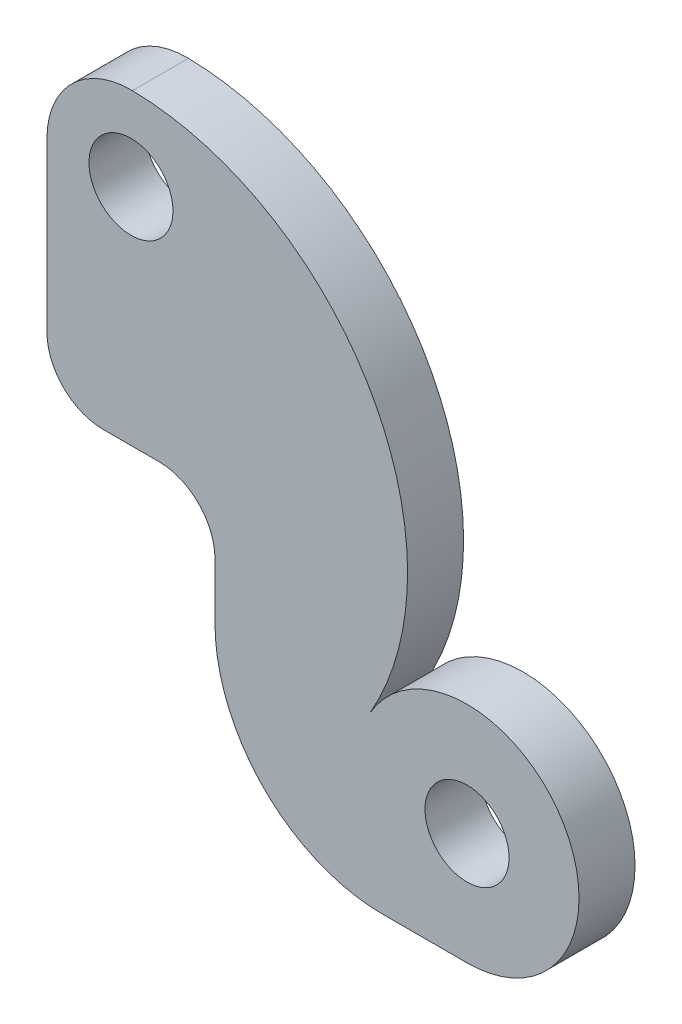
ISO-10303-21;
HEADER;
FILE_DESCRIPTION(('STEP AP214'),'2;1');
FILE_NAME('part.step','',(''),(''),'','','');
FILE_SCHEMA(('AUTOMOTIVE_DESIGN { 1 0 10303 214 1 1 1 1 }'));
ENDSEC;
DATA;
#1=APPLICATION_CONTEXT('core data for automotive mechanical design processes');
#2=APPLICATION_PROTOCOL_DEFINITION('international standard','automotive_design',2000,#1);
#3=PRODUCT_CONTEXT('',#1,'mechanical');
#4=PRODUCT('Part','Part','',(#3));
#5=PRODUCT_RELATED_PRODUCT_CATEGORY('part','',(#4));
#6=PRODUCT_DEFINITION_FORMATION('','',#4);
#7=PRODUCT_DEFINITION_CONTEXT('part definition',#1,'design');
#8=PRODUCT_DEFINITION('design','',#6,#7);
#9=PRODUCT_DEFINITION_SHAPE('','',#8);
#10=(LENGTH_UNIT() NAMED_UNIT(*) SI_UNIT(.MILLI.,.METRE.));
#11=(NAMED_UNIT(*) PLANE_ANGLE_UNIT() SI_UNIT($,.RADIAN.));
#12=(NAMED_UNIT(*) SI_UNIT($,.STERADIAN.) SOLID_ANGLE_UNIT());
#13=UNCERTAINTY_MEASURE_WITH_UNIT(LENGTH_MEASURE(1.E-05),#10,'distance_accuracy_value','');
#14=(GEOMETRIC_REPRESENTATION_CONTEXT(3) GLOBAL_UNCERTAINTY_ASSIGNED_CONTEXT((#13)) GLOBAL_UNIT_ASSIGNED_CONTEXT((#10,
#11,#12)) REPRESENTATION_CONTEXT('',''));
#15=CARTESIAN_POINT('',(0.,0.,0.));
#16=DIRECTION('',(0.,0.,1.));
#17=DIRECTION('',(1.,0.,0.));
#18=AXIS2_PLACEMENT_3D('',#15,#16,#17);
#19=CARTESIAN_POINT('',(-10.,20.,5.));
#20=DIRECTION('',(0.,0.,1.));
#21=DIRECTION('',(1.,0.,0.));
#22=AXIS2_PLACEMENT_3D('',#19,#20,#21);
#23=PLANE('',#22);
#24=CARTESIAN_POINT('',(45.,0.,5.));
#25=DIRECTION('',(0.,0.,1.));
#26=DIRECTION('',(1.,0.,0.));
#27=AXIS2_PLACEMENT_3D('',#24,#25,#26);
#28=CIRCLE('',#27,7.5);
#29=CARTESIAN_POINT('',(52.5,0.,5.));
#30=VERTEX_POINT('',#29);
#31=EDGE_CURVE('E150',#30,#30,#28,.T.);
#32=ORIENTED_EDGE('',*,*,#31,.F.);
#33=EDGE_LOOP('',(#32));
#34=FACE_BOUND('',#33,.T.);
#35=CARTESIAN_POINT('',(-10.,20.,5.));
#36=DIRECTION('',(0.,0.,-1.));
#37=DIRECTION('',(1.,0.,0.));
#38=AXIS2_PLACEMENT_3D('',#35,#36,#37);
#39=CIRCLE('',#38,10.);
#40=CARTESIAN_POINT('',(-10.0000000000001,30.,5.));
#41=VERTEX_POINT('',#40);
#42=CARTESIAN_POINT('',(0.,19.9999999999999,5.));
#43=VERTEX_POINT('',#42);
#44=EDGE_CURVE('E165',#41,#43,#39,.T.);
#45=ORIENTED_EDGE('',*,*,#44,.T.);
#46=DIRECTION('',(0.,-1.,0.));
#47=VECTOR('',#46,1.);
#48=CARTESIAN_POINT('',(0.,9.9999999999985,5.));
#49=LINE('',#48,#47);
#50=CARTESIAN_POINT('',(0.,9.9999999999985,5.));
#51=VERTEX_POINT('',#50);
#52=EDGE_CURVE('E103',#43,#51,#49,.T.);
#53=ORIENTED_EDGE('',*,*,#52,.T.);
#54=CARTESIAN_POINT('',(30.,9.99999999999829,5.));
#55=DIRECTION('',(0.,0.,1.));
#56=DIRECTION('',(1.,0.,0.));
#57=AXIS2_PLACEMENT_3D('',#54,#55,#56);
#58=CIRCLE('',#57,30.);
#59=CARTESIAN_POINT('',(30.0000000000036,-20.0000000000017,5.));
#60=VERTEX_POINT('',#59);
#61=EDGE_CURVE('E186',#51,#60,#58,.T.);
#62=ORIENTED_EDGE('',*,*,#61,.T.);
#63=DIRECTION('',(1.,1.13797860024106E-13,0.));
#64=VECTOR('',#63,1.);
#65=CARTESIAN_POINT('',(45.,-20.,5.));
#66=LINE('',#65,#64);
#67=CARTESIAN_POINT('',(45.,-20.,5.));
#68=VERTEX_POINT('',#67);
#69=EDGE_CURVE('E205',#60,#68,#66,.T.);
#70=ORIENTED_EDGE('',*,*,#69,.T.);
#71=CARTESIAN_POINT('',(45.,0.,5.));
#72=DIRECTION('',(0.,0.,1.));
#73=DIRECTION('',(1.,0.,0.));
#74=AXIS2_PLACEMENT_3D('',#71,#72,#73);
#75=CIRCLE('',#74,20.);
#76=CARTESIAN_POINT('',(27.6803939152465,10.0015621314358,5.));
#77=VERTEX_POINT('',#76);
#78=EDGE_CURVE('E202',#68,#77,#75,.T.);
#79=ORIENTED_EDGE('',*,*,#78,.T.);
#80=CARTESIAN_POINT('',(-15.6186212966372,35.0054674600253,5.));
#81=DIRECTION('',(0.,0.,1.));
#82=DIRECTION('',(-1.,0.,0.));
#83=AXIS2_PLACEMENT_3D('',#80,#81,#82);
#84=CIRCLE('',#83,50.);
#85=CARTESIAN_POINT('',(-14.7348765871555,84.9976568028463,5.));
#86=VERTEX_POINT('',#85);
#87=EDGE_CURVE('E204',#77,#86,#84,.T.);
#88=ORIENTED_EDGE('',*,*,#87,.T.);
#89=CARTESIAN_POINT('',(-15.,70.,5.));
#90=DIRECTION('',(0.,0.,1.));
#91=DIRECTION('',(1.,0.,0.));
#92=AXIS2_PLACEMENT_3D('',#89,#90,#91);
#93=CIRCLE('',#92,15.);
#94=CARTESIAN_POINT('',(-30.,70.,5.));
#95=VERTEX_POINT('',#94);
#96=EDGE_CURVE('E128',#86,#95,#93,.T.);
#97=ORIENTED_EDGE('',*,*,#96,.T.);
#98=DIRECTION('',(0.,-1.,0.));
#99=VECTOR('',#98,1.);
#100=CARTESIAN_POINT('',(-30.,70.,5.));
#101=LINE('',#100,#99);
#102=CARTESIAN_POINT('',(-30.,40.0000000000001,5.));
#103=VERTEX_POINT('',#102);
#104=EDGE_CURVE('E122',#95,#103,#101,.T.);
#105=ORIENTED_EDGE('',*,*,#104,.T.);
#106=CARTESIAN_POINT('',(-20.,40.,5.));
#107=DIRECTION('',(0.,0.,1.));
#108=DIRECTION('',(-1.,0.,0.));
#109=AXIS2_PLACEMENT_3D('',#106,#107,#108);
#110=CIRCLE('',#109,10.);
#111=CARTESIAN_POINT('',(-19.9999999999999,30.,5.));
#112=VERTEX_POINT('',#111);
#113=EDGE_CURVE('E126',#103,#112,#110,.T.);
#114=ORIENTED_EDGE('',*,*,#113,.T.);
#115=DIRECTION('',(1.,0.,0.));
#116=VECTOR('',#115,1.);
#117=CARTESIAN_POINT('',(-19.9999999999999,30.,5.));
#118=LINE('',#117,#116);
#119=EDGE_CURVE('E54',#112,#41,#118,.T.);
#120=ORIENTED_EDGE('',*,*,#119,.T.);
#121=EDGE_LOOP('',(#45,#53,#62,#70,#79,#88,#97,#105,#114,#120));
#122=FACE_BOUND('',#121,.T.);
#123=CARTESIAN_POINT('',(-15.,70.,5.));
#124=DIRECTION('',(0.,0.,1.));
#125=DIRECTION('',(1.,0.,0.));
#126=AXIS2_PLACEMENT_3D('',#123,#124,#125);
#127=CIRCLE('',#126,7.5);
#128=CARTESIAN_POINT('',(-7.50000000000001,70.,5.));
#129=VERTEX_POINT('',#128);
#130=EDGE_CURVE('E216',#129,#129,#127,.T.);
#131=ORIENTED_EDGE('',*,*,#130,.F.);
#132=EDGE_LOOP('',(#131));
#133=FACE_BOUND('',#132,.T.);
#134=ADVANCED_FACE('F37',(#34,#122,#133),#23,.T.);
#135=CARTESIAN_POINT('',(-10.,20.,-5.));
#136=DIRECTION('',(0.,0.,1.));
#137=DIRECTION('',(1.,0.,0.));
#138=AXIS2_PLACEMENT_3D('',#135,#136,#137);
#139=PLANE('',#138);
#140=CARTESIAN_POINT('',(-10.,20.,-5.));
#141=DIRECTION('',(0.,0.,-1.));
#142=DIRECTION('',(1.,0.,0.));
#143=AXIS2_PLACEMENT_3D('',#140,#141,#142);
#144=CIRCLE('',#143,10.);
#145=CARTESIAN_POINT('',(-10.0000000000001,30.,-5.));
#146=VERTEX_POINT('',#145);
#147=CARTESIAN_POINT('',(0.,19.9999999999999,-5.));
#148=VERTEX_POINT('',#147);
#149=EDGE_CURVE('E146',#146,#148,#144,.T.);
#150=ORIENTED_EDGE('',*,*,#149,.F.);
#151=DIRECTION('',(1.,0.,0.));
#152=VECTOR('',#151,1.);
#153=CARTESIAN_POINT('',(-19.9999999999999,30.,-5.));
#154=LINE('',#153,#152);
#155=CARTESIAN_POINT('',(-19.9999999999999,30.,-5.));
#156=VERTEX_POINT('',#155);
#157=EDGE_CURVE('E95',#156,#146,#154,.T.);
#158=ORIENTED_EDGE('',*,*,#157,.F.);
#159=CARTESIAN_POINT('',(-20.,40.,-5.));
#160=DIRECTION('',(0.,0.,1.));
#161=DIRECTION('',(-1.,0.,0.));
#162=AXIS2_PLACEMENT_3D('',#159,#160,#161);
#163=CIRCLE('',#162,10.);
#164=CARTESIAN_POINT('',(-30.,40.0000000000001,-5.));
#165=VERTEX_POINT('',#164);
#166=EDGE_CURVE('E89',#165,#156,#163,.T.);
#167=ORIENTED_EDGE('',*,*,#166,.F.);
#168=DIRECTION('',(0.,-1.,0.));
#169=VECTOR('',#168,1.);
#170=CARTESIAN_POINT('',(-30.,70.,-5.));
#171=LINE('',#170,#169);
#172=CARTESIAN_POINT('',(-30.,70.,-5.));
#173=VERTEX_POINT('',#172);
#174=EDGE_CURVE('E136',#173,#165,#171,.T.);
#175=ORIENTED_EDGE('',*,*,#174,.F.);
#176=CARTESIAN_POINT('',(-15.,70.,-5.));
#177=DIRECTION('',(0.,0.,1.));
#178=DIRECTION('',(1.,0.,0.));
#179=AXIS2_PLACEMENT_3D('',#176,#177,#178);
#180=CIRCLE('',#179,15.);
#181=CARTESIAN_POINT('',(-14.7348765871555,84.9976568028463,-5.));
#182=VERTEX_POINT('',#181);
#183=EDGE_CURVE('E160',#182,#173,#180,.T.);
#184=ORIENTED_EDGE('',*,*,#183,.F.);
#185=CARTESIAN_POINT('',(-15.6186212966372,35.0054674600253,-5.));
#186=DIRECTION('',(0.,0.,1.));
#187=DIRECTION('',(-1.,0.,0.));
#188=AXIS2_PLACEMENT_3D('',#185,#186,#187);
#189=CIRCLE('',#188,50.);
#190=CARTESIAN_POINT('',(27.6803939152465,10.0015621314358,-5.));
#191=VERTEX_POINT('',#190);
#192=EDGE_CURVE('E158',#191,#182,#189,.T.);
#193=ORIENTED_EDGE('',*,*,#192,.F.);
#194=CARTESIAN_POINT('',(45.,0.,-5.));
#195=DIRECTION('',(0.,0.,1.));
#196=DIRECTION('',(1.,0.,0.));
#197=AXIS2_PLACEMENT_3D('',#194,#195,#196);
#198=CIRCLE('',#197,20.);
#199=CARTESIAN_POINT('',(45.,-20.,-5.));
#200=VERTEX_POINT('',#199);
#201=EDGE_CURVE('E156',#200,#191,#198,.T.);
#202=ORIENTED_EDGE('',*,*,#201,.F.);
#203=DIRECTION('',(1.,1.13797860024106E-13,0.));
#204=VECTOR('',#203,1.);
#205=CARTESIAN_POINT('',(45.,-20.,-5.));
#206=LINE('',#205,#204);
#207=CARTESIAN_POINT('',(30.0000000000036,-20.0000000000017,-5.));
#208=VERTEX_POINT('',#207);
#209=EDGE_CURVE('E154',#208,#200,#206,.T.);
#210=ORIENTED_EDGE('',*,*,#209,.F.);
#211=CARTESIAN_POINT('',(30.,9.99999999999829,-5.));
#212=DIRECTION('',(0.,0.,1.));
#213=DIRECTION('',(1.,0.,0.));
#214=AXIS2_PLACEMENT_3D('',#211,#212,#213);
#215=CIRCLE('',#214,30.);
#216=CARTESIAN_POINT('',(0.,9.9999999999985,-5.));
#217=VERTEX_POINT('',#216);
#218=EDGE_CURVE('E152',#217,#208,#215,.T.);
#219=ORIENTED_EDGE('',*,*,#218,.F.);
#220=DIRECTION('',(0.,-1.,0.));
#221=VECTOR('',#220,1.);
#222=CARTESIAN_POINT('',(0.,9.9999999999985,-5.));
#223=LINE('',#222,#221);
#224=EDGE_CURVE('E149',#148,#217,#223,.T.);
#225=ORIENTED_EDGE('',*,*,#224,.F.);
#226=EDGE_LOOP('',(#150,#158,#167,#175,#184,#193,#202,#210,#219,#225));
#227=FACE_BOUND('',#226,.T.);
#228=CARTESIAN_POINT('',(45.,0.,-5.));
#229=DIRECTION('',(0.,0.,1.));
#230=DIRECTION('',(1.,0.,0.));
#231=AXIS2_PLACEMENT_3D('',#228,#229,#230);
#232=CIRCLE('',#231,7.5);
#233=CARTESIAN_POINT('',(52.5,0.,-5.));
#234=VERTEX_POINT('',#233);
#235=EDGE_CURVE('E213',#234,#234,#232,.T.);
#236=ORIENTED_EDGE('',*,*,#235,.T.);
#237=EDGE_LOOP('',(#236));
#238=FACE_BOUND('',#237,.T.);
#239=CARTESIAN_POINT('',(-15.,70.,-5.));
#240=DIRECTION('',(0.,0.,1.));
#241=DIRECTION('',(1.,0.,0.));
#242=AXIS2_PLACEMENT_3D('',#239,#240,#241);
#243=CIRCLE('',#242,7.5);
#244=CARTESIAN_POINT('',(-7.50000000000001,70.,-5.));
#245=VERTEX_POINT('',#244);
#246=EDGE_CURVE('E219',#245,#245,#243,.T.);
#247=ORIENTED_EDGE('',*,*,#246,.T.);
#248=EDGE_LOOP('',(#247));
#249=FACE_BOUND('',#248,.T.);
#250=ADVANCED_FACE('F190',(#227,#238,#249),#139,.F.);
#251=CARTESIAN_POINT('',(-10.,20.,5.));
#252=DIRECTION('',(0.,0.,-1.));
#253=DIRECTION('',(-1.,0.,0.));
#254=AXIS2_PLACEMENT_3D('',#251,#252,#253);
#255=CYLINDRICAL_SURFACE('',#254,10.);
#256=ORIENTED_EDGE('',*,*,#149,.T.);
#257=DIRECTION('',(0.,0.,-1.));
#258=VECTOR('',#257,1.);
#259=CARTESIAN_POINT('',(0.,19.9999999999999,5.));
#260=LINE('',#259,#258);
#261=EDGE_CURVE('E11',#43,#148,#260,.T.);
#262=ORIENTED_EDGE('',*,*,#261,.F.);
#263=ORIENTED_EDGE('',*,*,#44,.F.);
#264=DIRECTION('',(0.,0.,-1.));
#265=VECTOR('',#264,1.);
#266=CARTESIAN_POINT('',(-10.0000000000001,30.,5.));
#267=LINE('',#266,#265);
#268=EDGE_CURVE('E142',#41,#146,#267,.T.);
#269=ORIENTED_EDGE('',*,*,#268,.T.);
#270=EDGE_LOOP('',(#256,#262,#263,#269));
#271=FACE_BOUND('',#270,.T.);
#272=ADVANCED_FACE('F39',(#271),#255,.F.);
#273=CARTESIAN_POINT('',(0.,9.9999999999985,5.));
#274=DIRECTION('',(1.,0.,0.));
#275=DIRECTION('',(0.,0.,-1.));
#276=AXIS2_PLACEMENT_3D('',#273,#274,#275);
#277=PLANE('',#276);
#278=ORIENTED_EDGE('',*,*,#224,.T.);
#279=DIRECTION('',(0.,0.,-1.));
#280=VECTOR('',#279,1.);
#281=CARTESIAN_POINT('',(0.,9.9999999999985,5.));
#282=LINE('',#281,#280);
#283=EDGE_CURVE('E46',#51,#217,#282,.T.);
#284=ORIENTED_EDGE('',*,*,#283,.F.);
#285=ORIENTED_EDGE('',*,*,#52,.F.);
#286=ORIENTED_EDGE('',*,*,#261,.T.);
#287=EDGE_LOOP('',(#278,#284,#285,#286));
#288=FACE_BOUND('',#287,.T.);
#289=ADVANCED_FACE('F259',(#288),#277,.F.);
#290=CARTESIAN_POINT('',(30.,9.99999999999829,5.));
#291=DIRECTION('',(0.,0.,-1.));
#292=DIRECTION('',(-1.,0.,0.));
#293=AXIS2_PLACEMENT_3D('',#290,#291,#292);
#294=CYLINDRICAL_SURFACE('',#293,30.);
#295=ORIENTED_EDGE('',*,*,#218,.T.);
#296=DIRECTION('',(0.,0.,-1.));
#297=VECTOR('',#296,1.);
#298=CARTESIAN_POINT('',(30.0000000000036,-20.0000000000017,5.));
#299=LINE('',#298,#297);
#300=EDGE_CURVE('E178',#60,#208,#299,.T.);
#301=ORIENTED_EDGE('',*,*,#300,.F.);
#302=ORIENTED_EDGE('',*,*,#61,.F.);
#303=ORIENTED_EDGE('',*,*,#283,.T.);
#304=EDGE_LOOP('',(#295,#301,#302,#303));
#305=FACE_BOUND('',#304,.T.);
#306=ADVANCED_FACE('F184',(#305),#294,.T.);
#307=CARTESIAN_POINT('',(45.,-20.,5.));
#308=DIRECTION('',(-1.13797860024106E-13,1.,0.));
#309=DIRECTION('',(-1.,-1.13797860024106E-13,0.));
#310=AXIS2_PLACEMENT_3D('',#307,#308,#309);
#311=PLANE('',#310);
#312=ORIENTED_EDGE('',*,*,#209,.T.);
#313=DIRECTION('',(0.,0.,-1.));
#314=VECTOR('',#313,1.);
#315=CARTESIAN_POINT('',(45.,-20.,5.));
#316=LINE('',#315,#314);
#317=EDGE_CURVE('E175',#68,#200,#316,.T.);
#318=ORIENTED_EDGE('',*,*,#317,.F.);
#319=ORIENTED_EDGE('',*,*,#69,.F.);
#320=ORIENTED_EDGE('',*,*,#300,.T.);
#321=EDGE_LOOP('',(#312,#318,#319,#320));
#322=FACE_BOUND('',#321,.T.);
#323=ADVANCED_FACE('F196',(#322),#311,.F.);
#324=CARTESIAN_POINT('',(45.,0.,5.));
#325=DIRECTION('',(0.,0.,-1.));
#326=DIRECTION('',(-1.,0.,0.));
#327=AXIS2_PLACEMENT_3D('',#324,#325,#326);
#328=CYLINDRICAL_SURFACE('',#327,20.);
#329=ORIENTED_EDGE('',*,*,#201,.T.);
#330=DIRECTION('',(0.,0.,-1.));
#331=VECTOR('',#330,1.);
#332=CARTESIAN_POINT('',(27.6803939152465,10.0015621314358,5.));
#333=LINE('',#332,#331);
#334=EDGE_CURVE('E172',#77,#191,#333,.T.);
#335=ORIENTED_EDGE('',*,*,#334,.F.);
#336=ORIENTED_EDGE('',*,*,#78,.F.);
#337=ORIENTED_EDGE('',*,*,#317,.T.);
#338=EDGE_LOOP('',(#329,#335,#336,#337));
#339=FACE_BOUND('',#338,.T.);
#340=ADVANCED_FACE('F200',(#339),#328,.T.);
#341=CARTESIAN_POINT('',(-15.6186212966372,35.0054674600253,5.));
#342=DIRECTION('',(0.,0.,-1.));
#343=DIRECTION('',(-1.,0.,0.));
#344=AXIS2_PLACEMENT_3D('',#341,#342,#343);
#345=CYLINDRICAL_SURFACE('',#344,50.);
#346=ORIENTED_EDGE('',*,*,#192,.T.);
#347=DIRECTION('',(0.,0.,-1.));
#348=VECTOR('',#347,1.);
#349=CARTESIAN_POINT('',(-14.7348765871555,84.9976568028463,5.));
#350=LINE('',#349,#348);
#351=EDGE_CURVE('E169',#86,#182,#350,.T.);
#352=ORIENTED_EDGE('',*,*,#351,.F.);
#353=ORIENTED_EDGE('',*,*,#87,.F.);
#354=ORIENTED_EDGE('',*,*,#334,.T.);
#355=EDGE_LOOP('',(#346,#352,#353,#354));
#356=FACE_BOUND('',#355,.T.);
#357=ADVANCED_FACE('F249',(#356),#345,.T.);
#358=CARTESIAN_POINT('',(-15.,70.,5.));
#359=DIRECTION('',(0.,0.,-1.));
#360=DIRECTION('',(-1.,0.,0.));
#361=AXIS2_PLACEMENT_3D('',#358,#359,#360);
#362=CYLINDRICAL_SURFACE('',#361,15.);
#363=ORIENTED_EDGE('',*,*,#183,.T.);
#364=DIRECTION('',(0.,0.,-1.));
#365=VECTOR('',#364,1.);
#366=CARTESIAN_POINT('',(-30.,70.,5.));
#367=LINE('',#366,#365);
#368=EDGE_CURVE('E137',#95,#173,#367,.T.);
#369=ORIENTED_EDGE('',*,*,#368,.F.);
#370=ORIENTED_EDGE('',*,*,#96,.F.);
#371=ORIENTED_EDGE('',*,*,#351,.T.);
#372=EDGE_LOOP('',(#363,#369,#370,#371));
#373=FACE_BOUND('',#372,.T.);
#374=ADVANCED_FACE('F246',(#373),#362,.T.);
#375=CARTESIAN_POINT('',(-30.,70.,5.));
#376=DIRECTION('',(1.,0.,0.));
#377=DIRECTION('',(0.,1.,0.));
#378=AXIS2_PLACEMENT_3D('',#375,#376,#377);
#379=PLANE('',#378);
#380=ORIENTED_EDGE('',*,*,#174,.T.);
#381=DIRECTION('',(0.,0.,-1.));
#382=VECTOR('',#381,1.);
#383=CARTESIAN_POINT('',(-30.,40.0000000000001,5.));
#384=LINE('',#383,#382);
#385=EDGE_CURVE('E133',#103,#165,#384,.T.);
#386=ORIENTED_EDGE('',*,*,#385,.F.);
#387=ORIENTED_EDGE('',*,*,#104,.F.);
#388=ORIENTED_EDGE('',*,*,#368,.T.);
#389=EDGE_LOOP('',(#380,#386,#387,#388));
#390=FACE_BOUND('',#389,.T.);
#391=ADVANCED_FACE('F134',(#390),#379,.F.);
#392=CARTESIAN_POINT('',(-20.,40.,5.));
#393=DIRECTION('',(0.,0.,-1.));
#394=DIRECTION('',(-1.,0.,0.));
#395=AXIS2_PLACEMENT_3D('',#392,#393,#394);
#396=CYLINDRICAL_SURFACE('',#395,10.);
#397=ORIENTED_EDGE('',*,*,#166,.T.);
#398=DIRECTION('',(0.,0.,-1.));
#399=VECTOR('',#398,1.);
#400=CARTESIAN_POINT('',(-19.9999999999999,30.,5.));
#401=LINE('',#400,#399);
#402=EDGE_CURVE('E138',#112,#156,#401,.T.);
#403=ORIENTED_EDGE('',*,*,#402,.F.);
#404=ORIENTED_EDGE('',*,*,#113,.F.);
#405=ORIENTED_EDGE('',*,*,#385,.T.);
#406=EDGE_LOOP('',(#397,#403,#404,#405));
#407=FACE_BOUND('',#406,.T.);
#408=ADVANCED_FACE('F140',(#407),#396,.T.);
#409=CARTESIAN_POINT('',(-19.9999999999999,30.,5.));
#410=DIRECTION('',(0.,1.,0.));
#411=DIRECTION('',(0.,0.,1.));
#412=AXIS2_PLACEMENT_3D('',#409,#410,#411);
#413=PLANE('',#412);
#414=ORIENTED_EDGE('',*,*,#157,.T.);
#415=ORIENTED_EDGE('',*,*,#268,.F.);
#416=ORIENTED_EDGE('',*,*,#119,.F.);
#417=ORIENTED_EDGE('',*,*,#402,.T.);
#418=EDGE_LOOP('',(#414,#415,#416,#417));
#419=FACE_BOUND('',#418,.T.);
#420=ADVANCED_FACE('F239',(#419),#413,.F.);
#421=CARTESIAN_POINT('',(45.,0.,5.));
#422=DIRECTION('',(0.,0.,-1.));
#423=DIRECTION('',(-1.,0.,0.));
#424=AXIS2_PLACEMENT_3D('',#421,#422,#423);
#425=CYLINDRICAL_SURFACE('',#424,7.5);
#426=ORIENTED_EDGE('',*,*,#31,.T.);
#427=EDGE_LOOP('',(#426));
#428=FACE_BOUND('',#427,.T.);
#429=ORIENTED_EDGE('',*,*,#235,.F.);
#430=EDGE_LOOP('',(#429));
#431=FACE_BOUND('',#430,.T.);
#432=ADVANCED_FACE('F236',(#428,#431),#425,.F.);
#433=CARTESIAN_POINT('',(-15.,70.,5.));
#434=DIRECTION('',(0.,0.,-1.));
#435=DIRECTION('',(-1.,0.,0.));
#436=AXIS2_PLACEMENT_3D('',#433,#434,#435);
#437=CYLINDRICAL_SURFACE('',#436,7.5);
#438=ORIENTED_EDGE('',*,*,#130,.T.);
#439=EDGE_LOOP('',(#438));
#440=FACE_BOUND('',#439,.T.);
#441=ORIENTED_EDGE('',*,*,#246,.F.);
#442=EDGE_LOOP('',(#441));
#443=FACE_BOUND('',#442,.T.);
#444=ADVANCED_FACE('F225',(#440,#443),#437,.F.);
#445=CLOSED_SHELL('',(#134,#250,#272,#289,#306,#323,#340,#357,#374,#391,#408,#420,#432,#444));
#446=MANIFOLD_SOLID_BREP('B2',#445);
#447=ADVANCED_BREP_SHAPE_REPRESENTATION('',(#18,#446),#14);
#448=SHAPE_DEFINITION_REPRESENTATION(#9,#447);
ENDSEC;
END-ISO-10303-21;
